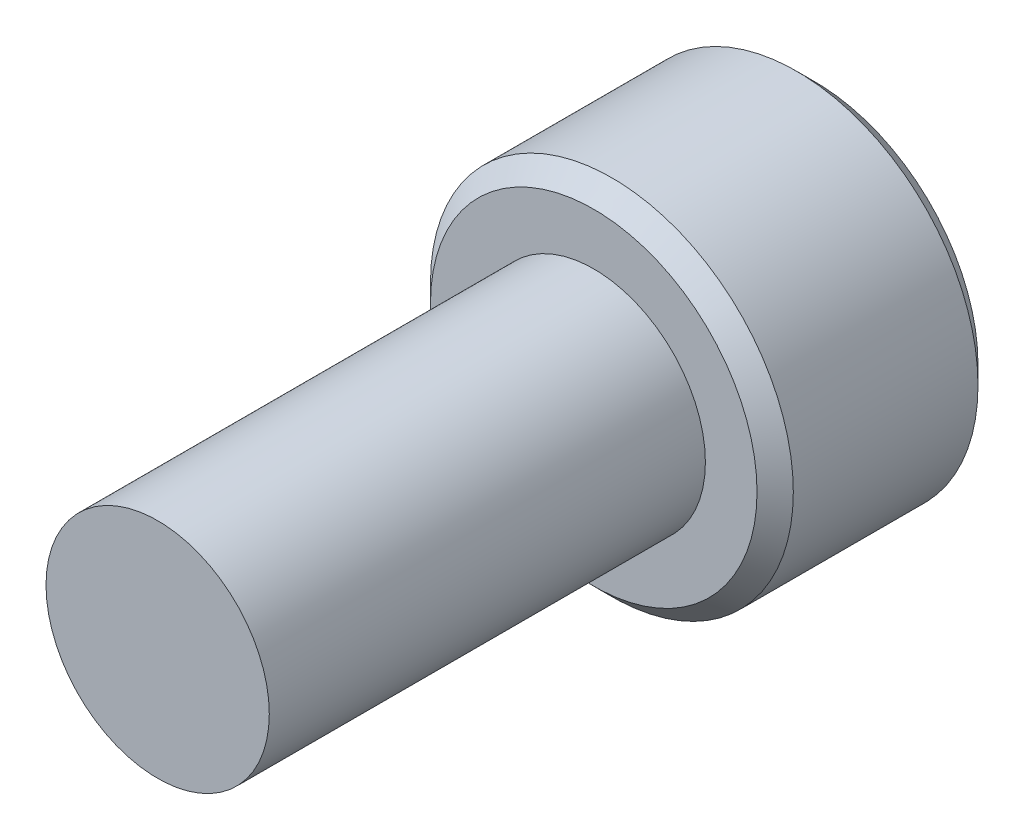
ISO-10303-21;
HEADER;
FILE_DESCRIPTION(('STEP AP214'),'2;1');
FILE_NAME('part.step','',(''),(''),'','','');
FILE_SCHEMA(('AUTOMOTIVE_DESIGN { 1 0 10303 214 1 1 1 1 }'));
ENDSEC;
DATA;
#1=APPLICATION_CONTEXT('core data for automotive mechanical design processes');
#2=APPLICATION_PROTOCOL_DEFINITION('international standard','automotive_design',2000,#1);
#3=PRODUCT_CONTEXT('',#1,'mechanical');
#4=PRODUCT('Part','Part','',(#3));
#5=PRODUCT_RELATED_PRODUCT_CATEGORY('part','',(#4));
#6=PRODUCT_DEFINITION_FORMATION('','',#4);
#7=PRODUCT_DEFINITION_CONTEXT('part definition',#1,'design');
#8=PRODUCT_DEFINITION('design','',#6,#7);
#9=PRODUCT_DEFINITION_SHAPE('','',#8);
#10=(LENGTH_UNIT() NAMED_UNIT(*) SI_UNIT(.MILLI.,.METRE.));
#11=(NAMED_UNIT(*) PLANE_ANGLE_UNIT() SI_UNIT($,.RADIAN.));
#12=(NAMED_UNIT(*) SI_UNIT($,.STERADIAN.) SOLID_ANGLE_UNIT());
#13=UNCERTAINTY_MEASURE_WITH_UNIT(LENGTH_MEASURE(1.E-05),#10,'distance_accuracy_value','');
#14=(GEOMETRIC_REPRESENTATION_CONTEXT(3) GLOBAL_UNCERTAINTY_ASSIGNED_CONTEXT((#13)) GLOBAL_UNIT_ASSIGNED_CONTEXT((#10,
#11,#12)) REPRESENTATION_CONTEXT('',''));
#15=CARTESIAN_POINT('',(0.,0.,0.));
#16=DIRECTION('',(0.,0.,1.));
#17=DIRECTION('',(1.,0.,0.));
#18=AXIS2_PLACEMENT_3D('',#15,#16,#17);
#19=CARTESIAN_POINT('',(1.984375,1.14567944042318,-11.3744375));
#20=DIRECTION('',(1.,0.,0.));
#21=DIRECTION('',(0.,0.,-1.));
#22=AXIS2_PLACEMENT_3D('',#19,#20,#21);
#23=PLANE('',#22);
#24=CARTESIAN_POINT('',(1.984375,-1.14567944041813,-14.3509999999952));
#25=CARTESIAN_POINT('',(1.98437500000006,-1.06743880341757,-14.3119161836657));
#26=CARTESIAN_POINT('',(1.98437500000003,-0.987898318959588,-14.2751144768878));
#27=CARTESIAN_POINT('',(1.98437499999997,-0.825677042055502,-14.2076562050431));
#28=CARTESIAN_POINT('',(1.98437499999994,-0.742979382570216,-14.1770405606477));
#29=CARTESIAN_POINT('',(1.98437500000006,-0.575193959625217,-14.1241739228619));
#30=CARTESIAN_POINT('',(1.98437500000022,-0.490115359200463,-14.1018946208352));
#31=CARTESIAN_POINT('',(1.98437499999979,-0.318093091240762,-14.0675946722377));
#32=CARTESIAN_POINT('',(1.98437499999921,-0.231156055100745,-14.0555423023027));
#33=CARTESIAN_POINT('',(1.98437500000022,-0.119918521625349,-14.0474911026414));
#34=CARTESIAN_POINT('',(1.98437500000054,-0.095946844396166,-14.0461894755759));
#35=CARTESIAN_POINT('',(1.98437499999946,-0.0479845644869839,-14.0444518262961));
#36=CARTESIAN_POINT('',(1.98437499999806,-0.0239939791818337,-14.0440153338598));
#37=CARTESIAN_POINT('',(1.98437499999577,0.0602201717359413,-14.0440180900825));
#38=CARTESIAN_POINT('',(1.98437499999884,0.120461721885839,-14.0467745229959));
#39=CARTESIAN_POINT('',(1.98437500000116,0.240474970949909,-14.0576365512437));
#40=CARTESIAN_POINT('',(1.9843750000004,0.300246312709274,-14.0657458774907));
#41=CARTESIAN_POINT('',(1.98437499999919,0.478763752725686,-14.097596229459));
#42=CARTESIAN_POINT('',(1.98437499999981,0.596208828839704,-14.1288542261021));
#43=CARTESIAN_POINT('',(1.98437500000012,0.78592148734036,-14.1928000359088));
#44=CARTESIAN_POINT('',(1.98437500000006,0.859734609781563,-14.2212345776806));
#45=CARTESIAN_POINT('',(1.98437499999994,1.00456595513682,-14.2828614040232));
#46=CARTESIAN_POINT('',(1.98437499999988,1.0756035665288,-14.3160077930301));
#47=CARTESIAN_POINT('',(1.984375,1.14567944041812,-14.3509999999952));
#48=B_SPLINE_CURVE_WITH_KNOTS('',3,(#24,#25,#26,#27,#28,#29,#30,#31,#32,#33,#34,#35,#36,#37,#38,
#39,#40,#41,#42,#43,#44,#45,#46,#47),.UNSPECIFIED.,.F.,.F.,(4,2,2,2,2,2,2,2,2,2,2,4),(0.,
0.262559005169385,0.526801735761589,0.79013882429106,1.05265603846582,1.12466619173774,
1.19663719497586,1.37727026722127,1.55802937202013,1.9210408507701,2.15819130084208,
2.3931726507569),.UNSPECIFIED.);
#49=CARTESIAN_POINT('',(1.98437499999081,-1.14567944041787,-14.3509999999871));
#50=VERTEX_POINT('',#49);
#51=CARTESIAN_POINT('',(1.9843749999908,1.14567944041785,-14.3509999999871));
#52=VERTEX_POINT('',#51);
#53=EDGE_CURVE('E20',#50,#52,#48,.T.);
#54=ORIENTED_EDGE('',*,*,#53,.F.);
#55=DIRECTION('',(0.,0.,1.));
#56=VECTOR('',#55,1.);
#57=CARTESIAN_POINT('',(1.984375,-1.14567944042318,-11.3744375));
#58=LINE('',#57,#56);
#59=CARTESIAN_POINT('',(1.984375,-1.14567944042318,-11.3744375));
#60=VERTEX_POINT('',#59);
#61=EDGE_CURVE('E82',#50,#60,#58,.T.);
#62=ORIENTED_EDGE('',*,*,#61,.T.);
#63=DIRECTION('',(0.,1.,0.));
#64=VECTOR('',#63,1.);
#65=CARTESIAN_POINT('',(1.984375,3.43703832126902,-11.3744375));
#66=LINE('',#65,#64);
#67=CARTESIAN_POINT('',(1.98437499999999,1.14567944042316,-11.3744375));
#68=VERTEX_POINT('',#67);
#69=EDGE_CURVE('E85',#68,#60,#66,.F.);
#70=ORIENTED_EDGE('',*,*,#69,.F.);
#71=DIRECTION('',(0.,0.,1.));
#72=VECTOR('',#71,1.);
#73=CARTESIAN_POINT('',(1.98437499999998,1.14567944042315,-11.3744375));
#74=LINE('',#73,#72);
#75=EDGE_CURVE('E268',#68,#52,#74,.F.);
#76=ORIENTED_EDGE('',*,*,#75,.T.);
#77=EDGE_LOOP('',(#54,#62,#70,#76));
#78=FACE_BOUND('',#77,.T.);
#79=ADVANCED_FACE('F16',(#78),#23,.F.);
#80=CARTESIAN_POINT('',(-1.984375,-1.14567944042318,-11.3744375));
#81=DIRECTION('',(-1.,0.,0.));
#82=DIRECTION('',(0.,0.,1.));
#83=AXIS2_PLACEMENT_3D('',#80,#81,#82);
#84=PLANE('',#83);
#85=CARTESIAN_POINT('',(-1.984375,1.14567944041813,-14.3509999999952));
#86=CARTESIAN_POINT('',(-1.984375,1.06743880341781,-14.3119161836659));
#87=CARTESIAN_POINT('',(-1.984375,0.98789831896008,-14.2751144768881));
#88=CARTESIAN_POINT('',(-1.984375,0.825677042056429,-14.2076562050434));
#89=CARTESIAN_POINT('',(-1.984375,0.742979382571322,-14.177040560648));
#90=CARTESIAN_POINT('',(-1.984375,0.575193959626282,-14.1241739228622));
#91=CARTESIAN_POINT('',(-1.984375,0.490115359201295,-14.1018946208354));
#92=CARTESIAN_POINT('',(-1.984375,0.318093091241164,-14.0675946722377));
#93=CARTESIAN_POINT('',(-1.984375,0.231156055100951,-14.0555423023024));
#94=CARTESIAN_POINT('',(-1.984375,0.11991852162534,-14.0474911026415));
#95=CARTESIAN_POINT('',(-1.984375,0.0959468443961481,-14.0461894755761));
#96=CARTESIAN_POINT('',(-1.984375,0.0479845644869658,-14.0444518262958));
#97=CARTESIAN_POINT('',(-1.984375,0.0239939791818247,-14.044015333859));
#98=CARTESIAN_POINT('',(-1.984375,-0.0602201717358421,-14.0440180900808));
#99=CARTESIAN_POINT('',(-1.984375,-0.12046172188564,-14.0467745229954));
#100=CARTESIAN_POINT('',(-1.984375,-0.24047497094962,-14.0576365512441));
#101=CARTESIAN_POINT('',(-1.984375,-0.300246312708992,-14.0657458774908));
#102=CARTESIAN_POINT('',(-1.984375,-0.478763752725491,-14.0975962294586));
#103=CARTESIAN_POINT('',(-1.984375,-0.596208828839578,-14.128854226102));
#104=CARTESIAN_POINT('',(-1.984375,-0.785921487340375,-14.1928000359088));
#105=CARTESIAN_POINT('',(-1.984375,-0.859734609781649,-14.2212345776806));
#106=CARTESIAN_POINT('',(-1.984375,-1.00456595513692,-14.2828614040232));
#107=CARTESIAN_POINT('',(-1.984375,-1.07560356652885,-14.3160077930301));
#108=CARTESIAN_POINT('',(-1.984375,-1.14567944041812,-14.3509999999952));
#109=B_SPLINE_CURVE_WITH_KNOTS('',3,(#85,#86,#87,#88,#89,#90,#91,#92,#93,#94,#95,#96,#97,#98,
#99,#100,#101,#102,#103,#104,#105,#106,#107,#108),.UNSPECIFIED.,.F.,.F.,(4,2,2,2,2,2,2,2,2,2,2,
4),(0.,0.262559005168572,0.526801735760239,0.790138824290454,1.05265603846582,1.12466619173776,
1.19663719497587,1.37727026722105,1.55802937201992,1.92104085077011,2.15819130084231,
2.39317265075697),.UNSPECIFIED.);
#110=CARTESIAN_POINT('',(-1.98437499998161,1.14567944043127,-14.3509999999858));
#111=VERTEX_POINT('',#110);
#112=CARTESIAN_POINT('',(-1.9843749999908,-1.14567944041785,-14.3509999999871));
#113=VERTEX_POINT('',#112);
#114=EDGE_CURVE('E59',#111,#113,#109,.T.);
#115=ORIENTED_EDGE('',*,*,#114,.F.);
#116=DIRECTION('',(0.,0.,1.));
#117=VECTOR('',#116,1.);
#118=CARTESIAN_POINT('',(-1.984375,1.14567944042318,-11.3744375));
#119=LINE('',#118,#117);
#120=CARTESIAN_POINT('',(-1.984375,1.14567944042318,-11.3744375));
#121=VERTEX_POINT('',#120);
#122=EDGE_CURVE('E266',#111,#121,#119,.T.);
#123=ORIENTED_EDGE('',*,*,#122,.T.);
#124=DIRECTION('',(0.,1.,0.));
#125=VECTOR('',#124,1.);
#126=CARTESIAN_POINT('',(-1.984375,3.43703832126902,-11.3744375));
#127=LINE('',#126,#125);
#128=CARTESIAN_POINT('',(-1.98437499999999,-1.14567944042316,-11.3744375));
#129=VERTEX_POINT('',#128);
#130=EDGE_CURVE('E99',#129,#121,#127,.T.);
#131=ORIENTED_EDGE('',*,*,#130,.F.);
#132=DIRECTION('',(0.,0.,1.));
#133=VECTOR('',#132,1.);
#134=CARTESIAN_POINT('',(-1.98437499999998,-1.14567944042315,-11.3744375));
#135=LINE('',#134,#133);
#136=EDGE_CURVE('E92',#129,#113,#135,.F.);
#137=ORIENTED_EDGE('',*,*,#136,.T.);
#138=EDGE_LOOP('',(#115,#123,#131,#137));
#139=FACE_BOUND('',#138,.T.);
#140=ADVANCED_FACE('F205',(#139),#84,.F.);
#141=CARTESIAN_POINT('',(1.984375,3.43703832126902,-11.3744375));
#142=DIRECTION('',(0.,0.,-1.));
#143=DIRECTION('',(-1.,0.,0.));
#144=AXIS2_PLACEMENT_3D('',#141,#142,#143);
#145=PLANE('',#144);
#146=ORIENTED_EDGE('',*,*,#130,.T.);
#147=DIRECTION('',(-0.866025403784429,-0.500000000000017,0.));
#148=VECTOR('',#147,1.);
#149=CARTESIAN_POINT('',(-1.984375,1.14567944042318,-11.3744375));
#150=LINE('',#149,#148);
#151=CARTESIAN_POINT('',(0.,2.29135888084638,-11.3744375));
#152=VERTEX_POINT('',#151);
#153=EDGE_CURVE('E68',#121,#152,#150,.F.);
#154=ORIENTED_EDGE('',*,*,#153,.T.);
#155=DIRECTION('',(-0.866025403784429,0.500000000000017,0.));
#156=VECTOR('',#155,1.);
#157=CARTESIAN_POINT('',(0.,2.29135888084635,-11.3744375));
#158=LINE('',#157,#156);
#159=EDGE_CURVE('E97',#152,#68,#158,.F.);
#160=ORIENTED_EDGE('',*,*,#159,.T.);
#161=ORIENTED_EDGE('',*,*,#69,.T.);
#162=DIRECTION('',(0.866025403784429,0.500000000000017,0.));
#163=VECTOR('',#162,1.);
#164=CARTESIAN_POINT('',(1.984375,-1.14567944042318,-11.3744375));
#165=LINE('',#164,#163);
#166=CARTESIAN_POINT('',(0.,-2.29135888084638,-11.3744375));
#167=VERTEX_POINT('',#166);
#168=EDGE_CURVE('E91',#60,#167,#165,.F.);
#169=ORIENTED_EDGE('',*,*,#168,.T.);
#170=DIRECTION('',(0.866025403784429,-0.500000000000017,0.));
#171=VECTOR('',#170,1.);
#172=CARTESIAN_POINT('',(0.,-2.29135888084635,-11.3744375));
#173=LINE('',#172,#171);
#174=EDGE_CURVE('E279',#167,#129,#173,.F.);
#175=ORIENTED_EDGE('',*,*,#174,.T.);
#176=EDGE_LOOP('',(#146,#154,#160,#161,#169,#175));
#177=FACE_BOUND('',#176,.T.);
#178=ADVANCED_FACE('F94',(#177),#145,.T.);
#179=CARTESIAN_POINT('',(0.,-2.29135888084635,-11.3744375));
#180=DIRECTION('',(-0.500000000000017,-0.866025403784429,0.));
#181=DIRECTION('',(0.866025403784429,-0.500000000000017,0.));
#182=AXIS2_PLACEMENT_3D('',#179,#180,#181);
#183=PLANE('',#182);
#184=ORIENTED_EDGE('',*,*,#136,.F.);
#185=ORIENTED_EDGE('',*,*,#174,.F.);
#186=DIRECTION('',(0.,0.,1.));
#187=VECTOR('',#186,1.);
#188=CARTESIAN_POINT('',(0.,-2.29135888084638,-11.3744375));
#189=LINE('',#188,#187);
#190=CARTESIAN_POINT('',(0.,-2.29135888083574,-14.3509999999871));
#191=VERTEX_POINT('',#190);
#192=EDGE_CURVE('E103',#167,#191,#189,.F.);
#193=ORIENTED_EDGE('',*,*,#192,.T.);
#194=CARTESIAN_POINT('',(-6.10039280094901E-12,-2.29135888084283,-14.3509999999942));
#195=CARTESIAN_POINT('',(-0.0682039378904026,-2.25198131894553,-14.3116602279693));
#196=CARTESIAN_POINT('',(-0.137548247015972,-2.21194536340512,-14.2746313284837));
#197=CARTESIAN_POINT('',(-0.278948409591937,-2.13030794147842,-14.2068329943007));
#198=CARTESIAN_POINT('',(-0.351017702857354,-2.08869871561133,-14.1761012702476));
#199=CARTESIAN_POINT('',(-0.496341897659653,-2.00479575262245,-14.1234576201705));
#200=CARTESIAN_POINT('',(-0.569559809453872,-1.96252337153855,-14.10141341203));
#201=CARTESIAN_POINT('',(-0.717607077579097,-1.87704824143366,-14.0674501107582));
#202=CARTESIAN_POINT('',(-0.79243191453034,-1.83384810167779,-14.0555056748104));
#203=CARTESIAN_POINT('',(-0.921395968094085,-1.75939067063697,-14.0447284276259));
#204=CARTESIAN_POINT('',(-0.975368691748498,-1.7282295041062,-14.043133528056));
#205=CARTESIAN_POINT('',(-1.08322583097001,-1.66595815574263,-14.0458239215062));
#206=CARTESIAN_POINT('',(-1.13711020895765,-1.63484799560635,-14.0501112755862));
#207=CARTESIAN_POINT('',(-1.24437008003224,-1.57292148016819,-14.0643221943582));
#208=CARTESIAN_POINT('',(-1.2977449362043,-1.54210549258929,-14.0742520606083));
#209=CARTESIAN_POINT('',(-1.40357163712892,-1.48100641832301,-14.0992029486151));
#210=CARTESIAN_POINT('',(-1.45602355234457,-1.45072329095374,-14.1142235799212));
#211=CARTESIAN_POINT('',(-1.59034408432847,-1.37317329565514,-14.158804789181));
#212=CARTESIAN_POINT('',(-1.67138069112859,-1.32638678890488,-14.1917221339985));
#213=CARTESIAN_POINT('',(-1.79053879231727,-1.25759082710746,-14.2472895205089));
#214=CARTESIAN_POINT('',(-1.82980683308315,-1.23491941320073,-14.266813093864));
#215=CARTESIAN_POINT('',(-1.90761582765043,-1.18999636924193,-14.3076397007331));
#216=CARTESIAN_POINT('',(-1.9461572095435,-1.16774449203103,-14.328941643688));
#217=CARTESIAN_POINT('',(-1.98437499999562,-1.14567944042567,-14.3509999999952));
#218=B_SPLINE_CURVE_WITH_KNOTS('',3,(#194,#195,#196,#197,#198,#199,#200,#201,#202,#203,#204,
#205,#206,#207,#208,#209,#210,#211,#212,#213,#214,#215,#216,#217),.UNSPECIFIED.,.F.,.F.,(4,2,2,
2,2,2,2,2,2,2,2,4),(0.,0.264284909651723,0.530108996408478,0.791712695488817,1.05265800184304,
1.23942150131089,1.42625045682737,1.61328847417573,1.80031214936551,2.09727151191515,
2.24534838945107,2.39333511880346),.UNSPECIFIED.);
#219=EDGE_CURVE('E189',#191,#113,#218,.T.);
#220=ORIENTED_EDGE('',*,*,#219,.T.);
#221=EDGE_LOOP('',(#184,#185,#193,#220));
#222=FACE_BOUND('',#221,.T.);
#223=ADVANCED_FACE('F198',(#222),#183,.F.);
#224=CARTESIAN_POINT('',(1.984375,-1.14567944042318,-11.3744375));
#225=DIRECTION('',(0.500000000000017,-0.866025403784429,0.));
#226=DIRECTION('',(0.866025403784429,0.500000000000017,0.));
#227=AXIS2_PLACEMENT_3D('',#224,#225,#226);
#228=PLANE('',#227);
#229=ORIENTED_EDGE('',*,*,#192,.F.);
#230=ORIENTED_EDGE('',*,*,#168,.F.);
#231=ORIENTED_EDGE('',*,*,#61,.F.);
#232=CARTESIAN_POINT('',(1.98437499999563,-1.1456794404257,-14.3509999999952));
#233=CARTESIAN_POINT('',(1.91617106211123,-1.18505700232305,-14.3116602279702));
#234=CARTESIAN_POINT('',(1.84682675298556,-1.22509295786353,-14.2746313284845));
#235=CARTESIAN_POINT('',(1.70542659040939,-1.30673037979034,-14.2068329943013));
#236=CARTESIAN_POINT('',(1.63335729714386,-1.3483396056575,-14.1761012702481));
#237=CARTESIAN_POINT('',(1.48803310234134,-1.43224256864651,-14.1234576201708));
#238=CARTESIAN_POINT('',(1.414815190547,-1.47451494973047,-14.1014134120303));
#239=CARTESIAN_POINT('',(1.26676792242153,-1.5599900798355,-14.0674501107583));
#240=CARTESIAN_POINT('',(1.19194308547017,-1.60319021959145,-14.0555056748105));
#241=CARTESIAN_POINT('',(1.06297903190629,-1.67764765063234,-14.044728427626));
#242=CARTESIAN_POINT('',(1.00900630825187,-1.70880881716312,-14.0431335280561));
#243=CARTESIAN_POINT('',(0.901149169030338,-1.77108016552669,-14.0458239215063));
#244=CARTESIAN_POINT('',(0.847264791042698,-1.80219032566298,-14.0501112755862));
#245=CARTESIAN_POINT('',(0.740004919968091,-1.86411684110115,-14.0643221943582));
#246=CARTESIAN_POINT('',(0.686630063796022,-1.89493282868005,-14.0742520606083));
#247=CARTESIAN_POINT('',(0.580803362871388,-1.95603190294634,-14.099202948615));
#248=CARTESIAN_POINT('',(0.528351447655734,-1.98631503031561,-14.1142235799212));
#249=CARTESIAN_POINT('',(0.394030915672091,-2.06386502561406,-14.1588047891808));
#250=CARTESIAN_POINT('',(0.312994308872226,-2.11065153236418,-14.1917221339982));
#251=CARTESIAN_POINT('',(0.193836207683911,-2.17944749416138,-14.2472895205084));
#252=CARTESIAN_POINT('',(0.154568166918148,-2.20211890806805,-14.2668130938634));
#253=CARTESIAN_POINT('',(0.0767591723510943,-2.24704195202671,-14.3076397007323));
#254=CARTESIAN_POINT('',(0.0382177904581434,-2.26929382923755,-14.3289416436872));
#255=CARTESIAN_POINT('',(6.13194483962739E-12,-2.29135888084285,-14.3509999999942));
#256=B_SPLINE_CURVE_WITH_KNOTS('',3,(#232,#233,#234,#235,#236,#237,#238,#239,#240,#241,#242,
#243,#244,#245,#246,#247,#248,#249,#250,#251,#252,#253,#254,#255),.UNSPECIFIED.,.F.,.F.,(4,2,2,
2,2,2,2,2,2,2,2,4),(0.,0.264284909652163,0.530108996409366,0.791712695490153,1.05265800184482,
1.2394215013127,1.4262504568292,1.61328847417757,1.80031214936737,2.09727151191606,
2.24534838945151,2.39333511880343),.UNSPECIFIED.);
#257=EDGE_CURVE('E182',#50,#191,#256,.T.);
#258=ORIENTED_EDGE('',*,*,#257,.T.);
#259=EDGE_LOOP('',(#229,#230,#231,#258));
#260=FACE_BOUND('',#259,.T.);
#261=ADVANCED_FACE('F102',(#260),#228,.F.);
#262=CARTESIAN_POINT('',(0.,2.29135888084635,-11.3744375));
#263=DIRECTION('',(0.500000000000017,0.866025403784429,0.));
#264=DIRECTION('',(-0.866025403784429,0.500000000000017,0.));
#265=AXIS2_PLACEMENT_3D('',#262,#263,#264);
#266=PLANE('',#265);
#267=ORIENTED_EDGE('',*,*,#75,.F.);
#268=ORIENTED_EDGE('',*,*,#159,.F.);
#269=DIRECTION('',(0.,0.,1.));
#270=VECTOR('',#269,1.);
#271=CARTESIAN_POINT('',(0.,2.29135888084638,-11.3744375));
#272=LINE('',#271,#270);
#273=CARTESIAN_POINT('',(0.,2.29135888083574,-14.3509999999871));
#274=VERTEX_POINT('',#273);
#275=EDGE_CURVE('E40',#152,#274,#272,.F.);
#276=ORIENTED_EDGE('',*,*,#275,.T.);
#277=CARTESIAN_POINT('',(6.10033195472353E-12,2.29135888084283,-14.3509999999942));
#278=CARTESIAN_POINT('',(0.0682039378904026,2.25198131894553,-14.3116602279693));
#279=CARTESIAN_POINT('',(0.137548247015972,2.21194536340512,-14.2746313284837));
#280=CARTESIAN_POINT('',(0.278948409591937,2.13030794147842,-14.2068329943007));
#281=CARTESIAN_POINT('',(0.351017702857354,2.08869871561133,-14.1761012702476));
#282=CARTESIAN_POINT('',(0.496341897659653,2.00479575262245,-14.1234576201705));
#283=CARTESIAN_POINT('',(0.569559809453872,1.96252337153855,-14.10141341203));
#284=CARTESIAN_POINT('',(0.717607077579096,1.87704824143366,-14.0674501107582));
#285=CARTESIAN_POINT('',(0.792431914530339,1.83384810167779,-14.0555056748104));
#286=CARTESIAN_POINT('',(0.921395968094084,1.75939067063697,-14.0447284276259));
#287=CARTESIAN_POINT('',(0.975368691748497,1.7282295041062,-14.043133528056));
#288=CARTESIAN_POINT('',(1.08322583097001,1.66595815574263,-14.0458239215062));
#289=CARTESIAN_POINT('',(1.13711020895765,1.63484799560635,-14.0501112755862));
#290=CARTESIAN_POINT('',(1.24437008003224,1.57292148016819,-14.0643221943582));
#291=CARTESIAN_POINT('',(1.2977449362043,1.54210549258929,-14.0742520606083));
#292=CARTESIAN_POINT('',(1.40357163712892,1.48100641832301,-14.0992029486151));
#293=CARTESIAN_POINT('',(1.45602355234457,1.45072329095374,-14.1142235799212));
#294=CARTESIAN_POINT('',(1.59034408432847,1.37317329565514,-14.158804789181));
#295=CARTESIAN_POINT('',(1.67138069112859,1.32638678890488,-14.1917221339985));
#296=CARTESIAN_POINT('',(1.79053879231727,1.25759082710746,-14.2472895205089));
#297=CARTESIAN_POINT('',(1.82980683308315,1.23491941320073,-14.266813093864));
#298=CARTESIAN_POINT('',(1.90761582765043,1.18999636924193,-14.3076397007331));
#299=CARTESIAN_POINT('',(1.9461572095435,1.16774449203103,-14.328941643688));
#300=CARTESIAN_POINT('',(1.98437499999562,1.14567944042566,-14.3509999999952));
#301=B_SPLINE_CURVE_WITH_KNOTS('',3,(#277,#278,#279,#280,#281,#282,#283,#284,#285,#286,#287,
#288,#289,#290,#291,#292,#293,#294,#295,#296,#297,#298,#299,#300),.UNSPECIFIED.,.F.,.F.,(4,2,2,
2,2,2,2,2,2,2,2,4),(0.,0.264284909651723,0.530108996408478,0.791712695488817,1.05265800184304,
1.23942150131089,1.42625045682737,1.61328847417573,1.80031214936551,2.09727151191515,
2.24534838945107,2.39333511880347),.UNSPECIFIED.);
#302=EDGE_CURVE('E148',#274,#52,#301,.T.);
#303=ORIENTED_EDGE('',*,*,#302,.T.);
#304=EDGE_LOOP('',(#267,#268,#276,#303));
#305=FACE_BOUND('',#304,.T.);
#306=ADVANCED_FACE('F197',(#305),#266,.F.);
#307=CARTESIAN_POINT('',(-1.984375,1.14567944042318,-11.3744375));
#308=DIRECTION('',(-0.500000000000017,0.866025403784429,0.));
#309=DIRECTION('',(-0.866025403784429,-0.500000000000017,0.));
#310=AXIS2_PLACEMENT_3D('',#307,#308,#309);
#311=PLANE('',#310);
#312=ORIENTED_EDGE('',*,*,#275,.F.);
#313=ORIENTED_EDGE('',*,*,#153,.F.);
#314=ORIENTED_EDGE('',*,*,#122,.F.);
#315=CARTESIAN_POINT('',(-1.98437499999563,1.1456794404257,-14.3509999999952));
#316=CARTESIAN_POINT('',(-1.91617106211123,1.18505700232305,-14.3116602279702));
#317=CARTESIAN_POINT('',(-1.84682675298556,1.22509295786353,-14.2746313284845));
#318=CARTESIAN_POINT('',(-1.70542659040939,1.30673037979034,-14.2068329943013));
#319=CARTESIAN_POINT('',(-1.63335729714386,1.3483396056575,-14.1761012702481));
#320=CARTESIAN_POINT('',(-1.48803310234134,1.43224256864651,-14.1234576201708));
#321=CARTESIAN_POINT('',(-1.414815190547,1.47451494973047,-14.1014134120303));
#322=CARTESIAN_POINT('',(-1.26676792242153,1.5599900798355,-14.0674501107583));
#323=CARTESIAN_POINT('',(-1.19194308547017,1.60319021959145,-14.0555056748105));
#324=CARTESIAN_POINT('',(-1.06297903190629,1.67764765063234,-14.044728427626));
#325=CARTESIAN_POINT('',(-1.00900630825187,1.70880881716312,-14.0431335280561));
#326=CARTESIAN_POINT('',(-0.901149169030339,1.77108016552669,-14.0458239215063));
#327=CARTESIAN_POINT('',(-0.847264791042698,1.80219032566297,-14.0501112755862));
#328=CARTESIAN_POINT('',(-0.740004919968091,1.86411684110115,-14.0643221943582));
#329=CARTESIAN_POINT('',(-0.686630063796023,1.89493282868005,-14.0742520606083));
#330=CARTESIAN_POINT('',(-0.580803362871389,1.95603190294634,-14.099202948615));
#331=CARTESIAN_POINT('',(-0.528351447655734,1.98631503031561,-14.1142235799212));
#332=CARTESIAN_POINT('',(-0.394030915672091,2.06386502561406,-14.1588047891808));
#333=CARTESIAN_POINT('',(-0.312994308872226,2.11065153236418,-14.1917221339982));
#334=CARTESIAN_POINT('',(-0.193836207683911,2.17944749416138,-14.2472895205084));
#335=CARTESIAN_POINT('',(-0.154568166918148,2.20211890806805,-14.2668130938634));
#336=CARTESIAN_POINT('',(-0.0767591723510947,2.24704195202671,-14.3076397007323));
#337=CARTESIAN_POINT('',(-0.0382177904581437,2.26929382923755,-14.3289416436872));
#338=CARTESIAN_POINT('',(-6.13196155860193E-12,2.29135888084285,-14.3509999999942));
#339=B_SPLINE_CURVE_WITH_KNOTS('',3,(#315,#316,#317,#318,#319,#320,#321,#322,#323,#324,#325,
#326,#327,#328,#329,#330,#331,#332,#333,#334,#335,#336,#337,#338),.UNSPECIFIED.,.F.,.F.,(4,2,2,
2,2,2,2,2,2,2,2,4),(0.,0.264284909652163,0.530108996409366,0.791712695490153,1.05265800184482,
1.2394215013127,1.4262504568292,1.61328847417757,1.80031214936737,2.09727151191606,
2.2453483894515,2.39333511880343),.UNSPECIFIED.);
#340=EDGE_CURVE('E140',#111,#274,#339,.T.);
#341=ORIENTED_EDGE('',*,*,#340,.T.);
#342=EDGE_LOOP('',(#312,#313,#314,#341));
#343=FACE_BOUND('',#342,.T.);
#344=ADVANCED_FACE('F156',(#343),#311,.F.);
#345=CARTESIAN_POINT('',(0.,0.,-14.3509999999196));
#346=DIRECTION('',(0.,0.,-1.));
#347=DIRECTION('',(-1.,0.,0.));
#348=AXIS2_PLACEMENT_3D('',#345,#346,#347);
#349=CONICAL_SURFACE('',#348,2.29135888076826,0.785398163397448);
#350=CARTESIAN_POINT('',(0.,0.,-14.3509999999765));
#351=DIRECTION('',(0.,0.,-1.));
#352=DIRECTION('',(-1.,0.,0.));
#353=AXIS2_PLACEMENT_3D('',#350,#351,#352);
#354=CIRCLE('',#353,2.2913588808251);
#355=EDGE_CURVE('E137',#111,#113,#354,.F.);
#356=ORIENTED_EDGE('',*,*,#355,.F.);
#357=ORIENTED_EDGE('',*,*,#114,.T.);
#358=EDGE_LOOP('',(#356,#357));
#359=FACE_BOUND('',#358,.T.);
#360=ADVANCED_FACE('F212',(#359),#349,.F.);
#361=CARTESIAN_POINT('',(0.,0.,-14.3509999999765));
#362=DIRECTION('',(0.,0.,-1.));
#363=DIRECTION('',(-1.,0.,0.));
#364=AXIS2_PLACEMENT_3D('',#361,#362,#363);
#365=CONICAL_SURFACE('',#364,2.2913588808251,0.785398163489468);
#366=CARTESIAN_POINT('',(0.,0.,-14.3509999999765));
#367=DIRECTION('',(0.,0.,-1.));
#368=DIRECTION('',(-1.,0.,0.));
#369=AXIS2_PLACEMENT_3D('',#366,#367,#368);
#370=CIRCLE('',#369,2.2913588808251);
#371=EDGE_CURVE('E134',#113,#191,#370,.F.);
#372=ORIENTED_EDGE('',*,*,#371,.F.);
#373=ORIENTED_EDGE('',*,*,#219,.F.);
#374=EDGE_LOOP('',(#372,#373));
#375=FACE_BOUND('',#374,.T.);
#376=ADVANCED_FACE('F179',(#375),#365,.F.);
#377=CARTESIAN_POINT('',(0.,0.,-14.3509999999765));
#378=DIRECTION('',(0.,0.,-1.));
#379=DIRECTION('',(-1.,0.,0.));
#380=AXIS2_PLACEMENT_3D('',#377,#378,#379);
#381=CONICAL_SURFACE('',#380,2.2913588808251,0.785398163489468);
#382=CARTESIAN_POINT('',(0.,0.,-14.3509999999765));
#383=DIRECTION('',(0.,0.,-1.));
#384=DIRECTION('',(-1.,0.,0.));
#385=AXIS2_PLACEMENT_3D('',#382,#383,#384);
#386=CIRCLE('',#385,2.2913588808251);
#387=EDGE_CURVE('E131',#191,#50,#386,.F.);
#388=ORIENTED_EDGE('',*,*,#387,.F.);
#389=ORIENTED_EDGE('',*,*,#257,.F.);
#390=EDGE_LOOP('',(#388,#389));
#391=FACE_BOUND('',#390,.T.);
#392=ADVANCED_FACE('F174',(#391),#381,.F.);
#393=CARTESIAN_POINT('',(0.,0.,-14.3509999999196));
#394=DIRECTION('',(0.,0.,-1.));
#395=DIRECTION('',(-1.,0.,0.));
#396=AXIS2_PLACEMENT_3D('',#393,#394,#395);
#397=CONICAL_SURFACE('',#396,2.29135888076826,0.785398163397448);
#398=CARTESIAN_POINT('',(0.,0.,-14.3509999999765));
#399=DIRECTION('',(0.,0.,-1.));
#400=DIRECTION('',(-1.,0.,0.));
#401=AXIS2_PLACEMENT_3D('',#398,#399,#400);
#402=CIRCLE('',#401,2.2913588808251);
#403=EDGE_CURVE('E128',#50,#52,#402,.F.);
#404=ORIENTED_EDGE('',*,*,#403,.F.);
#405=ORIENTED_EDGE('',*,*,#53,.T.);
#406=EDGE_LOOP('',(#404,#405));
#407=FACE_BOUND('',#406,.T.);
#408=ADVANCED_FACE('F169',(#407),#397,.F.);
#409=CARTESIAN_POINT('',(0.,0.,-14.3509999999765));
#410=DIRECTION('',(0.,0.,-1.));
#411=DIRECTION('',(-1.,0.,0.));
#412=AXIS2_PLACEMENT_3D('',#409,#410,#411);
#413=CONICAL_SURFACE('',#412,2.2913588808251,0.785398163489468);
#414=CARTESIAN_POINT('',(0.,0.,-14.3509999999765));
#415=DIRECTION('',(0.,0.,-1.));
#416=DIRECTION('',(-1.,0.,0.));
#417=AXIS2_PLACEMENT_3D('',#414,#415,#416);
#418=CIRCLE('',#417,2.2913588808251);
#419=EDGE_CURVE('E125',#52,#274,#418,.F.);
#420=ORIENTED_EDGE('',*,*,#419,.F.);
#421=ORIENTED_EDGE('',*,*,#302,.F.);
#422=EDGE_LOOP('',(#420,#421));
#423=FACE_BOUND('',#422,.T.);
#424=ADVANCED_FACE('F164',(#423),#413,.F.);
#425=CARTESIAN_POINT('',(0.,0.,-14.3509999999765));
#426=DIRECTION('',(0.,0.,-1.));
#427=DIRECTION('',(-1.,0.,0.));
#428=AXIS2_PLACEMENT_3D('',#425,#426,#427);
#429=CONICAL_SURFACE('',#428,2.2913588808251,0.785398163489468);
#430=CARTESIAN_POINT('',(0.,0.,-14.3509999999765));
#431=DIRECTION('',(0.,0.,-1.));
#432=DIRECTION('',(-1.,0.,0.));
#433=AXIS2_PLACEMENT_3D('',#430,#431,#432);
#434=CIRCLE('',#433,2.2913588808251);
#435=EDGE_CURVE('E122',#274,#111,#434,.F.);
#436=ORIENTED_EDGE('',*,*,#435,.F.);
#437=ORIENTED_EDGE('',*,*,#340,.F.);
#438=EDGE_LOOP('',(#436,#437));
#439=FACE_BOUND('',#438,.T.);
#440=ADVANCED_FACE('F159',(#439),#429,.F.);
#441=CARTESIAN_POINT('',(0.,0.,-14.351));
#442=DIRECTION('',(0.,0.,-1.));
#443=DIRECTION('',(-1.,0.,0.));
#444=AXIS2_PLACEMENT_3D('',#441,#442,#443);
#445=PLANE('',#444);
#446=ORIENTED_EDGE('',*,*,#419,.T.);
#447=ORIENTED_EDGE('',*,*,#435,.T.);
#448=ORIENTED_EDGE('',*,*,#355,.T.);
#449=ORIENTED_EDGE('',*,*,#371,.T.);
#450=ORIENTED_EDGE('',*,*,#387,.T.);
#451=ORIENTED_EDGE('',*,*,#403,.T.);
#452=EDGE_LOOP('',(#446,#447,#448,#449,#450,#451));
#453=FACE_BOUND('',#452,.T.);
#454=CARTESIAN_POINT('',(0.,0.,-14.3509999999765));
#455=DIRECTION('',(0.,0.,1.));
#456=DIRECTION('',(1.,0.,0.));
#457=AXIS2_PLACEMENT_3D('',#454,#455,#456);
#458=CIRCLE('',#457,3.56615999999121);
#459=CARTESIAN_POINT('',(3.56615999999121,0.,-14.3509999999765));
#460=VERTEX_POINT('',#459);
#461=EDGE_CURVE('E118',#460,#460,#458,.T.);
#462=ORIENTED_EDGE('',*,*,#461,.F.);
#463=EDGE_LOOP('',(#462));
#464=FACE_BOUND('',#463,.T.);
#465=ADVANCED_FACE('F163',(#453,#464),#445,.T.);
#466=CARTESIAN_POINT('',(0.,0.,-13.9547600000469));
#467=DIRECTION('',(0.,0.,1.));
#468=DIRECTION('',(1.,0.,0.));
#469=AXIS2_PLACEMENT_3D('',#466,#467,#468);
#470=CONICAL_SURFACE('',#469,3.96239999992076,0.785398163397448);
#471=CARTESIAN_POINT('',(0.,0.,-13.95476));
#472=DIRECTION('',(0.,0.,1.));
#473=DIRECTION('',(1.,0.,0.));
#474=AXIS2_PLACEMENT_3D('',#471,#472,#473);
#475=CIRCLE('',#474,3.9624);
#476=CARTESIAN_POINT('',(3.9624,0.,-13.95476));
#477=VERTEX_POINT('',#476);
#478=EDGE_CURVE('E121',#477,#477,#475,.T.);
#479=ORIENTED_EDGE('',*,*,#478,.F.);
#480=EDGE_LOOP('',(#479));
#481=FACE_BOUND('',#480,.T.);
#482=ORIENTED_EDGE('',*,*,#461,.T.);
#483=EDGE_LOOP('',(#482));
#484=FACE_BOUND('',#483,.T.);
#485=ADVANCED_FACE('F245',(#481,#484),#470,.T.);
#486=CARTESIAN_POINT('',(0.,0.,-14.351));
#487=DIRECTION('',(0.,0.,1.));
#488=DIRECTION('',(1.,0.,0.));
#489=AXIS2_PLACEMENT_3D('',#486,#487,#488);
#490=CYLINDRICAL_SURFACE('',#489,3.9624);
#491=CARTESIAN_POINT('',(0.,0.,-9.92123999998284));
#492=DIRECTION('',(0.,0.,-1.));
#493=DIRECTION('',(-1.,0.,0.));
#494=AXIS2_PLACEMENT_3D('',#491,#492,#493);
#495=CIRCLE('',#494,3.96239999997761);
#496=CARTESIAN_POINT('',(-3.96239999997761,0.,-9.92123999998284));
#497=VERTEX_POINT('',#496);
#498=EDGE_CURVE('E117',#497,#497,#495,.F.);
#499=ORIENTED_EDGE('',*,*,#498,.F.);
#500=EDGE_LOOP('',(#499));
#501=FACE_BOUND('',#500,.T.);
#502=ORIENTED_EDGE('',*,*,#478,.T.);
#503=EDGE_LOOP('',(#502));
#504=FACE_BOUND('',#503,.T.);
#505=ADVANCED_FACE('F242',(#501,#504),#490,.T.);
#506=CARTESIAN_POINT('',(0.,0.,-9.92123999998284));
#507=DIRECTION('',(0.,0.,-1.));
#508=DIRECTION('',(-1.,0.,0.));
#509=AXIS2_PLACEMENT_3D('',#506,#507,#508);
#510=CONICAL_SURFACE('',#509,3.96239999997761,0.78539816332572);
#511=ORIENTED_EDGE('',*,*,#498,.T.);
#512=EDGE_LOOP('',(#511));
#513=FACE_BOUND('',#512,.T.);
#514=CARTESIAN_POINT('',(0.,0.,-9.52499999993961));
#515=DIRECTION('',(0.,0.,-1.));
#516=DIRECTION('',(-1.,0.,0.));
#517=AXIS2_PLACEMENT_3D('',#514,#515,#516);
#518=CIRCLE('',#517,3.56615999999121);
#519=CARTESIAN_POINT('',(-3.56615999999121,0.,-9.52499999993961));
#520=VERTEX_POINT('',#519);
#521=EDGE_CURVE('E114',#520,#520,#518,.T.);
#522=ORIENTED_EDGE('',*,*,#521,.T.);
#523=EDGE_LOOP('',(#522));
#524=FACE_BOUND('',#523,.T.);
#525=ADVANCED_FACE('F238',(#513,#524),#510,.T.);
#526=CARTESIAN_POINT('',(0.,0.,0.));
#527=DIRECTION('',(0.,0.,1.));
#528=DIRECTION('',(1.,0.,0.));
#529=AXIS2_PLACEMENT_3D('',#526,#527,#528);
#530=PLANE('',#529);
#531=CARTESIAN_POINT('',(0.,0.,0.));
#532=DIRECTION('',(0.,0.,1.));
#533=DIRECTION('',(1.,0.,0.));
#534=AXIS2_PLACEMENT_3D('',#531,#532,#533);
#535=CIRCLE('',#534,2.4384);
#536=CARTESIAN_POINT('',(2.4384,0.,0.));
#537=VERTEX_POINT('',#536);
#538=EDGE_CURVE('E31',#537,#537,#535,.F.);
#539=ORIENTED_EDGE('',*,*,#538,.F.);
#540=EDGE_LOOP('',(#539));
#541=FACE_BOUND('',#540,.T.);
#542=ADVANCED_FACE('F231',(#541),#530,.T.);
#543=CARTESIAN_POINT('',(0.,0.,-9.525));
#544=DIRECTION('',(0.,0.,-1.));
#545=DIRECTION('',(-1.,0.,0.));
#546=AXIS2_PLACEMENT_3D('',#543,#544,#545);
#547=PLANE('',#546);
#548=CARTESIAN_POINT('',(0.,0.,-9.525));
#549=DIRECTION('',(0.,0.,1.));
#550=DIRECTION('',(1.,0.,0.));
#551=AXIS2_PLACEMENT_3D('',#548,#549,#550);
#552=CIRCLE('',#551,2.4384);
#553=CARTESIAN_POINT('',(2.4384,0.,-9.525));
#554=VERTEX_POINT('',#553);
#555=EDGE_CURVE('E11',#554,#554,#552,.T.);
#556=ORIENTED_EDGE('',*,*,#555,.F.);
#557=EDGE_LOOP('',(#556));
#558=FACE_BOUND('',#557,.T.);
#559=ORIENTED_EDGE('',*,*,#521,.F.);
#560=EDGE_LOOP('',(#559));
#561=FACE_BOUND('',#560,.T.);
#562=ADVANCED_FACE('F225',(#558,#561),#547,.F.);
#563=CARTESIAN_POINT('',(0.,0.,0.));
#564=DIRECTION('',(0.,0.,1.));
#565=DIRECTION('',(1.,0.,0.));
#566=AXIS2_PLACEMENT_3D('',#563,#564,#565);
#567=CYLINDRICAL_SURFACE('',#566,2.4384);
#568=ORIENTED_EDGE('',*,*,#538,.T.);
#569=EDGE_LOOP('',(#568));
#570=FACE_BOUND('',#569,.T.);
#571=ORIENTED_EDGE('',*,*,#555,.T.);
#572=EDGE_LOOP('',(#571));
#573=FACE_BOUND('',#572,.T.);
#574=ADVANCED_FACE('F223',(#570,#573),#567,.T.);
#575=CLOSED_SHELL('',(#79,#140,#178,#223,#261,#306,#344,#360,#376,#392,#408,#424,#440,#465,#485,
#505,#525,#542,#562,#574));
#576=MANIFOLD_SOLID_BREP('B1',#575);
#577=ADVANCED_BREP_SHAPE_REPRESENTATION('',(#18,#576),#14);
#578=SHAPE_DEFINITION_REPRESENTATION(#9,#577);
ENDSEC;
END-ISO-10303-21;
